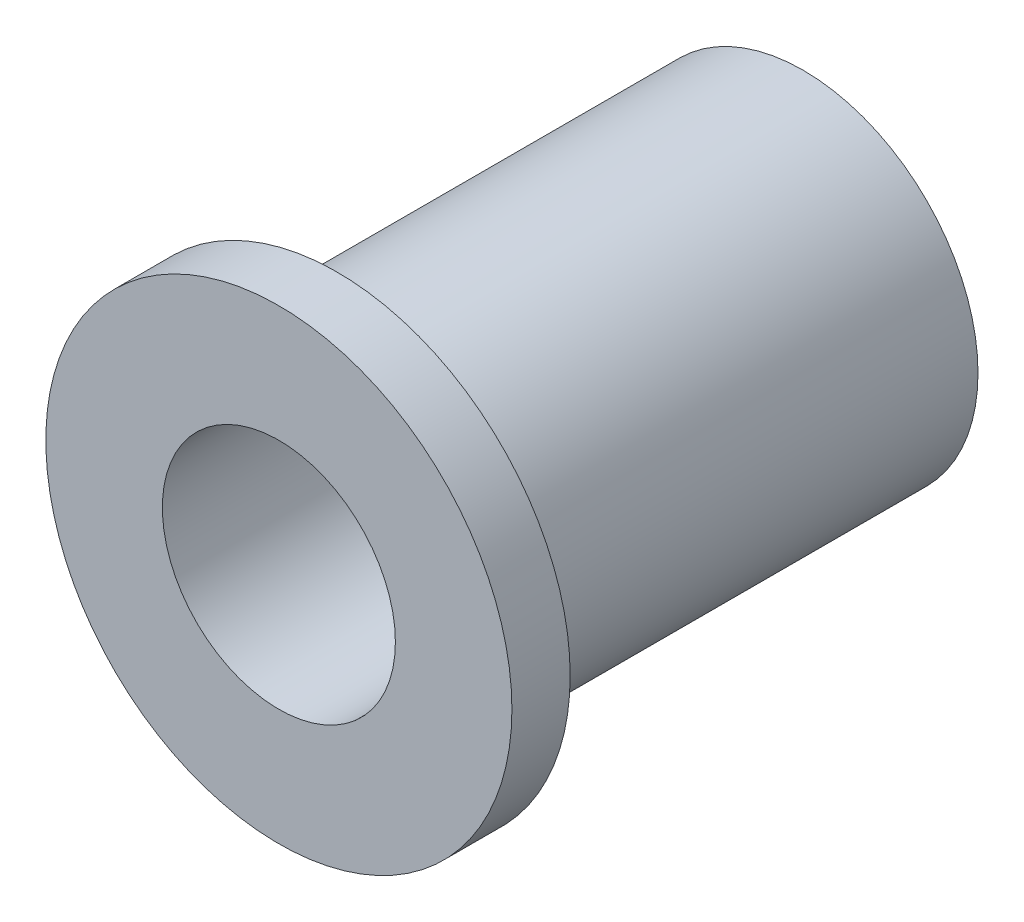
ISO-10303-21;
HEADER;
FILE_DESCRIPTION(('STEP AP214'),'2;1');
FILE_NAME('part.step','',(''),(''),'','','');
FILE_SCHEMA(('AUTOMOTIVE_DESIGN { 1 0 10303 214 1 1 1 1 }'));
ENDSEC;
DATA;
#1=APPLICATION_CONTEXT('core data for automotive mechanical design processes');
#2=APPLICATION_PROTOCOL_DEFINITION('international standard','automotive_design',2000,#1);
#3=PRODUCT_CONTEXT('',#1,'mechanical');
#4=PRODUCT('Part','Part','',(#3));
#5=PRODUCT_RELATED_PRODUCT_CATEGORY('part','',(#4));
#6=PRODUCT_DEFINITION_FORMATION('','',#4);
#7=PRODUCT_DEFINITION_CONTEXT('part definition',#1,'design');
#8=PRODUCT_DEFINITION('design','',#6,#7);
#9=PRODUCT_DEFINITION_SHAPE('','',#8);
#10=(LENGTH_UNIT() NAMED_UNIT(*) SI_UNIT(.MILLI.,.METRE.));
#11=(NAMED_UNIT(*) PLANE_ANGLE_UNIT() SI_UNIT($,.RADIAN.));
#12=(NAMED_UNIT(*) SI_UNIT($,.STERADIAN.) SOLID_ANGLE_UNIT());
#13=UNCERTAINTY_MEASURE_WITH_UNIT(LENGTH_MEASURE(1.E-05),#10,'distance_accuracy_value','');
#14=(GEOMETRIC_REPRESENTATION_CONTEXT(3) GLOBAL_UNCERTAINTY_ASSIGNED_CONTEXT((#13)) GLOBAL_UNIT_ASSIGNED_CONTEXT((#10,
#11,#12)) REPRESENTATION_CONTEXT('',''));
#15=CARTESIAN_POINT('',(0.,0.,0.));
#16=DIRECTION('',(0.,0.,1.));
#17=DIRECTION('',(1.,0.,0.));
#18=AXIS2_PLACEMENT_3D('',#15,#16,#17);
#19=CARTESIAN_POINT('',(0.,0.,-12.7));
#20=DIRECTION('',(0.,0.,1.));
#21=DIRECTION('',(1.,0.,0.));
#22=AXIS2_PLACEMENT_3D('',#19,#20,#21);
#23=PLANE('',#22);
#24=CARTESIAN_POINT('',(0.,0.,-12.7));
#25=DIRECTION('',(0.,0.,1.));
#26=DIRECTION('',(1.,0.,0.));
#27=AXIS2_PLACEMENT_3D('',#24,#25,#26);
#28=CIRCLE('',#27,9.525);
#29=CARTESIAN_POINT('',(9.525,0.,-12.7));
#30=VERTEX_POINT('',#29);
#31=EDGE_CURVE('E35',#30,#30,#28,.T.);
#32=ORIENTED_EDGE('',*,*,#31,.F.);
#33=EDGE_LOOP('',(#32));
#34=FACE_BOUND('',#33,.T.);
#35=CARTESIAN_POINT('',(0.,0.,-12.7));
#36=DIRECTION('',(0.,0.,1.));
#37=DIRECTION('',(1.,0.,0.));
#38=AXIS2_PLACEMENT_3D('',#35,#36,#37);
#39=CIRCLE('',#38,6.35);
#40=CARTESIAN_POINT('',(6.35,0.,-12.7));
#41=VERTEX_POINT('',#40);
#42=EDGE_CURVE('E42',#41,#41,#39,.T.);
#43=ORIENTED_EDGE('',*,*,#42,.T.);
#44=EDGE_LOOP('',(#43));
#45=FACE_BOUND('',#44,.T.);
#46=ADVANCED_FACE('F31',(#34,#45),#23,.F.);
#47=CARTESIAN_POINT('',(0.,0.,12.7));
#48=DIRECTION('',(0.,0.,-1.));
#49=DIRECTION('',(-1.,0.,0.));
#50=AXIS2_PLACEMENT_3D('',#47,#48,#49);
#51=CYLINDRICAL_SURFACE('',#50,9.525);
#52=CARTESIAN_POINT('',(0.,0.,12.7));
#53=DIRECTION('',(0.,0.,1.));
#54=DIRECTION('',(1.,0.,0.));
#55=AXIS2_PLACEMENT_3D('',#52,#53,#54);
#56=CIRCLE('',#55,9.525);
#57=CARTESIAN_POINT('',(9.525,0.,12.7));
#58=VERTEX_POINT('',#57);
#59=EDGE_CURVE('E10',#58,#58,#56,.T.);
#60=ORIENTED_EDGE('',*,*,#59,.F.);
#61=EDGE_LOOP('',(#60));
#62=FACE_BOUND('',#61,.T.);
#63=ORIENTED_EDGE('',*,*,#31,.T.);
#64=EDGE_LOOP('',(#63));
#65=FACE_BOUND('',#64,.T.);
#66=ADVANCED_FACE('F33',(#62,#65),#51,.T.);
#67=CARTESIAN_POINT('',(0.,0.,12.7));
#68=DIRECTION('',(0.,0.,-1.));
#69=DIRECTION('',(-1.,0.,0.));
#70=AXIS2_PLACEMENT_3D('',#67,#68,#69);
#71=CYLINDRICAL_SURFACE('',#70,6.35);
#72=ORIENTED_EDGE('',*,*,#42,.F.);
#73=EDGE_LOOP('',(#72));
#74=FACE_BOUND('',#73,.T.);
#75=CARTESIAN_POINT('',(0.,0.,15.875));
#76=DIRECTION('',(0.,0.,1.));
#77=DIRECTION('',(1.,0.,0.));
#78=AXIS2_PLACEMENT_3D('',#75,#76,#77);
#79=CIRCLE('',#78,6.35);
#80=CARTESIAN_POINT('',(6.35,0.,15.875));
#81=VERTEX_POINT('',#80);
#82=EDGE_CURVE('E50',#81,#81,#79,.T.);
#83=ORIENTED_EDGE('',*,*,#82,.T.);
#84=EDGE_LOOP('',(#83));
#85=FACE_BOUND('',#84,.T.);
#86=ADVANCED_FACE('F56',(#74,#85),#71,.F.);
#87=CARTESIAN_POINT('',(0.,0.,12.7));
#88=DIRECTION('',(0.,0.,1.));
#89=DIRECTION('',(1.,0.,0.));
#90=AXIS2_PLACEMENT_3D('',#87,#88,#89);
#91=PLANE('',#90);
#92=CARTESIAN_POINT('',(0.,0.,12.7));
#93=DIRECTION('',(0.,0.,1.));
#94=DIRECTION('',(1.,0.,0.));
#95=AXIS2_PLACEMENT_3D('',#92,#93,#94);
#96=CIRCLE('',#95,12.7);
#97=CARTESIAN_POINT('',(12.7,0.,12.7));
#98=VERTEX_POINT('',#97);
#99=EDGE_CURVE('E47',#98,#98,#96,.T.);
#100=ORIENTED_EDGE('',*,*,#99,.F.);
#101=EDGE_LOOP('',(#100));
#102=FACE_BOUND('',#101,.T.);
#103=ORIENTED_EDGE('',*,*,#59,.T.);
#104=EDGE_LOOP('',(#103));
#105=FACE_BOUND('',#104,.T.);
#106=ADVANCED_FACE('F61',(#102,#105),#91,.F.);
#107=CARTESIAN_POINT('',(0.,0.,15.875));
#108=DIRECTION('',(0.,0.,1.));
#109=DIRECTION('',(1.,0.,0.));
#110=AXIS2_PLACEMENT_3D('',#107,#108,#109);
#111=PLANE('',#110);
#112=CARTESIAN_POINT('',(0.,0.,15.875));
#113=DIRECTION('',(0.,0.,1.));
#114=DIRECTION('',(1.,0.,0.));
#115=AXIS2_PLACEMENT_3D('',#112,#113,#114);
#116=CIRCLE('',#115,12.7);
#117=CARTESIAN_POINT('',(12.7,0.,15.875));
#118=VERTEX_POINT('',#117);
#119=EDGE_CURVE('E46',#118,#118,#116,.T.);
#120=ORIENTED_EDGE('',*,*,#119,.T.);
#121=EDGE_LOOP('',(#120));
#122=FACE_BOUND('',#121,.T.);
#123=ORIENTED_EDGE('',*,*,#82,.F.);
#124=EDGE_LOOP('',(#123));
#125=FACE_BOUND('',#124,.T.);
#126=ADVANCED_FACE('F58',(#122,#125),#111,.T.);
#127=CARTESIAN_POINT('',(0.,0.,15.875));
#128=DIRECTION('',(0.,0.,-1.));
#129=DIRECTION('',(-1.,0.,0.));
#130=AXIS2_PLACEMENT_3D('',#127,#128,#129);
#131=CYLINDRICAL_SURFACE('',#130,12.7);
#132=ORIENTED_EDGE('',*,*,#119,.F.);
#133=EDGE_LOOP('',(#132));
#134=FACE_BOUND('',#133,.T.);
#135=ORIENTED_EDGE('',*,*,#99,.T.);
#136=EDGE_LOOP('',(#135));
#137=FACE_BOUND('',#136,.T.);
#138=ADVANCED_FACE('F60',(#134,#137),#131,.T.);
#139=CLOSED_SHELL('',(#46,#66,#86,#106,#126,#138));
#140=MANIFOLD_SOLID_BREP('B2',#139);
#141=ADVANCED_BREP_SHAPE_REPRESENTATION('',(#18,#140),#14);
#142=SHAPE_DEFINITION_REPRESENTATION(#9,#141);
ENDSEC;
END-ISO-10303-21;
